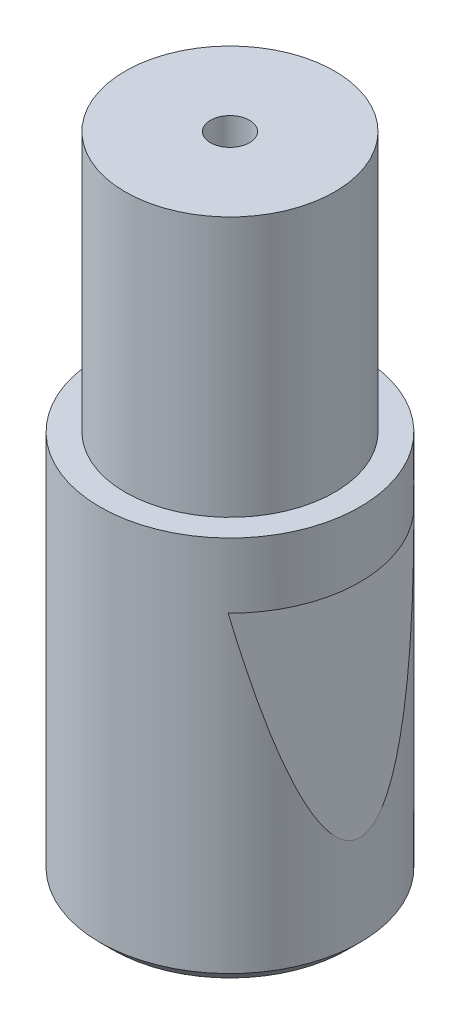
ISO-10303-21;
HEADER;
FILE_DESCRIPTION(('STEP AP214'),'2;1');
FILE_NAME('part.step','',(''),(''),'','','');
FILE_SCHEMA(('AUTOMOTIVE_DESIGN { 1 0 10303 214 1 1 1 1 }'));
ENDSEC;
DATA;
#1=APPLICATION_CONTEXT('core data for automotive mechanical design processes');
#2=APPLICATION_PROTOCOL_DEFINITION('international standard','automotive_design',2000,#1);
#3=PRODUCT_CONTEXT('',#1,'mechanical');
#4=PRODUCT('Part','Part','',(#3));
#5=PRODUCT_RELATED_PRODUCT_CATEGORY('part','',(#4));
#6=PRODUCT_DEFINITION_FORMATION('','',#4);
#7=PRODUCT_DEFINITION_CONTEXT('part definition',#1,'design');
#8=PRODUCT_DEFINITION('design','',#6,#7);
#9=PRODUCT_DEFINITION_SHAPE('','',#8);
#10=(LENGTH_UNIT() NAMED_UNIT(*) SI_UNIT(.MILLI.,.METRE.));
#11=(NAMED_UNIT(*) PLANE_ANGLE_UNIT() SI_UNIT($,.RADIAN.));
#12=(NAMED_UNIT(*) SI_UNIT($,.STERADIAN.) SOLID_ANGLE_UNIT());
#13=UNCERTAINTY_MEASURE_WITH_UNIT(LENGTH_MEASURE(1.E-05),#10,'distance_accuracy_value','');
#14=(GEOMETRIC_REPRESENTATION_CONTEXT(3) GLOBAL_UNCERTAINTY_ASSIGNED_CONTEXT((#13)) GLOBAL_UNIT_ASSIGNED_CONTEXT((#10,
#11,#12)) REPRESENTATION_CONTEXT('',''));
#15=CARTESIAN_POINT('',(0.,0.,0.));
#16=DIRECTION('',(0.,0.,1.));
#17=DIRECTION('',(1.,0.,0.));
#18=AXIS2_PLACEMENT_3D('',#15,#16,#17);
#19=CARTESIAN_POINT('',(0.,30.,0.));
#20=DIRECTION('',(0.,1.,0.));
#21=DIRECTION('',(0.,0.,1.));
#22=AXIS2_PLACEMENT_3D('',#19,#20,#21);
#23=PLANE('',#22);
#24=CARTESIAN_POINT('',(0.,30.,0.));
#25=DIRECTION('',(0.,1.,0.));
#26=DIRECTION('',(0.,0.,1.));
#27=AXIS2_PLACEMENT_3D('',#24,#25,#26);
#28=CIRCLE('',#27,10.);
#29=CARTESIAN_POINT('',(0.,30.,10.));
#30=VERTEX_POINT('',#29);
#31=EDGE_CURVE('E63',#30,#30,#28,.T.);
#32=ORIENTED_EDGE('',*,*,#31,.T.);
#33=EDGE_LOOP('',(#32));
#34=FACE_BOUND('',#33,.T.);
#35=CARTESIAN_POINT('',(0.,30.,0.));
#36=DIRECTION('',(0.,1.,0.));
#37=DIRECTION('',(0.,0.,1.));
#38=AXIS2_PLACEMENT_3D('',#35,#36,#37);
#39=CIRCLE('',#38,8.05);
#40=CARTESIAN_POINT('',(0.,30.,8.05));
#41=VERTEX_POINT('',#40);
#42=EDGE_CURVE('E53',#41,#41,#39,.T.);
#43=ORIENTED_EDGE('',*,*,#42,.F.);
#44=EDGE_LOOP('',(#43));
#45=FACE_BOUND('',#44,.T.);
#46=ADVANCED_FACE('F17',(#34,#45),#23,.T.);
#47=CARTESIAN_POINT('',(0.,30.,0.));
#48=DIRECTION('',(0.,-1.,0.));
#49=DIRECTION('',(0.,0.,-1.));
#50=AXIS2_PLACEMENT_3D('',#47,#48,#49);
#51=CYLINDRICAL_SURFACE('',#50,10.);
#52=CARTESIAN_POINT('',(0.,1.,0.));
#53=DIRECTION('',(0.,1.,0.));
#54=DIRECTION('',(0.,0.,1.));
#55=AXIS2_PLACEMENT_3D('',#52,#53,#54);
#56=CIRCLE('',#55,10.);
#57=CARTESIAN_POINT('',(0.,1.,10.));
#58=VERTEX_POINT('',#57);
#59=EDGE_CURVE('E25',#58,#58,#56,.T.);
#60=ORIENTED_EDGE('',*,*,#59,.T.);
#61=EDGE_LOOP('',(#60));
#62=FACE_BOUND('',#61,.T.);
#63=CARTESIAN_POINT('',(0.,64.6989727373255,0.));
#64=DIRECTION('',(-0.984807753012209,-0.173648177666924,0.));
#65=DIRECTION('',(0.173648177666924,-0.984807753012209,0.));
#66=AXIS2_PLACEMENT_3D('',#63,#64,#65);
#67=ELLIPSE('',#66,57.5877048314386,10.);
#68=CARTESIAN_POINT('',(7.,25.,-7.14142842854285));
#69=VERTEX_POINT('',#68);
#70=CARTESIAN_POINT('',(7.,25.,7.14142842854285));
#71=VERTEX_POINT('',#70);
#72=EDGE_CURVE('E37',#69,#71,#67,.T.);
#73=ORIENTED_EDGE('',*,*,#72,.T.);
#74=CARTESIAN_POINT('',(0.,25.,0.));
#75=DIRECTION('',(0.,1.,0.));
#76=DIRECTION('',(0.,0.,1.));
#77=AXIS2_PLACEMENT_3D('',#74,#75,#76);
#78=CIRCLE('',#77,10.);
#79=EDGE_CURVE('E68',#71,#69,#78,.T.);
#80=ORIENTED_EDGE('',*,*,#79,.T.);
#81=EDGE_LOOP('',(#73,#80));
#82=FACE_BOUND('',#81,.T.);
#83=ORIENTED_EDGE('',*,*,#31,.F.);
#84=EDGE_LOOP('',(#83));
#85=FACE_BOUND('',#84,.T.);
#86=ADVANCED_FACE('F73',(#62,#82,#85),#51,.T.);
#87=CARTESIAN_POINT('',(0.,0.,0.));
#88=DIRECTION('',(0.,1.,0.));
#89=DIRECTION('',(0.,0.,1.));
#90=AXIS2_PLACEMENT_3D('',#87,#88,#89);
#91=PLANE('',#90);
#92=CARTESIAN_POINT('',(0.,0.,0.));
#93=DIRECTION('',(0.,1.,0.));
#94=DIRECTION('',(0.,0.,1.));
#95=AXIS2_PLACEMENT_3D('',#92,#93,#94);
#96=CIRCLE('',#95,9.);
#97=CARTESIAN_POINT('',(0.,0.,9.));
#98=VERTEX_POINT('',#97);
#99=EDGE_CURVE('E11',#98,#98,#96,.F.);
#100=ORIENTED_EDGE('',*,*,#99,.T.);
#101=EDGE_LOOP('',(#100));
#102=FACE_BOUND('',#101,.T.);
#103=ADVANCED_FACE('F94',(#102),#91,.F.);
#104=CARTESIAN_POINT('',(0.,50.,0.));
#105=DIRECTION('',(0.,-1.,0.));
#106=DIRECTION('',(0.,0.,-1.));
#107=AXIS2_PLACEMENT_3D('',#104,#105,#106);
#108=CYLINDRICAL_SURFACE('',#107,8.05);
#109=CARTESIAN_POINT('',(0.,50.,0.));
#110=DIRECTION('',(0.,1.,0.));
#111=DIRECTION('',(0.,0.,1.));
#112=AXIS2_PLACEMENT_3D('',#109,#110,#111);
#113=CIRCLE('',#112,8.05);
#114=CARTESIAN_POINT('',(0.,50.,8.05));
#115=VERTEX_POINT('',#114);
#116=EDGE_CURVE('E60',#115,#115,#113,.T.);
#117=ORIENTED_EDGE('',*,*,#116,.F.);
#118=EDGE_LOOP('',(#117));
#119=FACE_BOUND('',#118,.T.);
#120=ORIENTED_EDGE('',*,*,#42,.T.);
#121=EDGE_LOOP('',(#120));
#122=FACE_BOUND('',#121,.T.);
#123=ADVANCED_FACE('F98',(#119,#122),#108,.T.);
#124=CARTESIAN_POINT('',(0.,50.,0.));
#125=DIRECTION('',(0.,1.,0.));
#126=DIRECTION('',(0.,0.,1.));
#127=AXIS2_PLACEMENT_3D('',#124,#125,#126);
#128=PLANE('',#127);
#129=CARTESIAN_POINT('',(0.,50.,0.));
#130=DIRECTION('',(0.,1.,0.));
#131=DIRECTION('',(0.,0.,1.));
#132=AXIS2_PLACEMENT_3D('',#129,#130,#131);
#133=CIRCLE('',#132,1.5);
#134=CARTESIAN_POINT('',(0.,50.,1.5));
#135=VERTEX_POINT('',#134);
#136=EDGE_CURVE('E139',#135,#135,#133,.T.);
#137=ORIENTED_EDGE('',*,*,#136,.F.);
#138=EDGE_LOOP('',(#137));
#139=FACE_BOUND('',#138,.T.);
#140=ORIENTED_EDGE('',*,*,#116,.T.);
#141=EDGE_LOOP('',(#140));
#142=FACE_BOUND('',#141,.T.);
#143=ADVANCED_FACE('F106',(#139,#142),#128,.T.);
#144=CARTESIAN_POINT('',(7.,25.,-10.));
#145=DIRECTION('',(-0.984807753012209,-0.173648177666924,0.));
#146=DIRECTION('',(0.173648177666924,-0.984807753012209,0.));
#147=AXIS2_PLACEMENT_3D('',#144,#145,#146);
#148=PLANE('',#147);
#149=ORIENTED_EDGE('',*,*,#72,.F.);
#150=DIRECTION('',(0.,0.,1.));
#151=VECTOR('',#150,1.);
#152=CARTESIAN_POINT('',(7.,25.,-10.));
#153=LINE('',#152,#151);
#154=EDGE_CURVE('E31',#69,#71,#153,.T.);
#155=ORIENTED_EDGE('',*,*,#154,.T.);
#156=EDGE_LOOP('',(#149,#155));
#157=FACE_BOUND('',#156,.T.);
#158=ADVANCED_FACE('F112',(#157),#148,.F.);
#159=CARTESIAN_POINT('',(10.,25.,-10.));
#160=DIRECTION('',(0.,1.,0.));
#161=DIRECTION('',(0.,0.,1.));
#162=AXIS2_PLACEMENT_3D('',#159,#160,#161);
#163=PLANE('',#162);
#164=ORIENTED_EDGE('',*,*,#154,.F.);
#165=ORIENTED_EDGE('',*,*,#79,.F.);
#166=EDGE_LOOP('',(#164,#165));
#167=FACE_BOUND('',#166,.T.);
#168=ADVANCED_FACE('F45',(#167),#163,.F.);
#169=CARTESIAN_POINT('',(0.,39.5,0.));
#170=DIRECTION('',(0.,1.,0.));
#171=DIRECTION('',(0.,0.,1.));
#172=AXIS2_PLACEMENT_3D('',#169,#170,#171);
#173=CONICAL_SURFACE('',#172,1.25,1.02974425867665);
#174=CARTESIAN_POINT('',(0.,38.7489242262155,0.));
#175=VERTEX_POINT('',#174);
#176=VERTEX_LOOP('',#175);
#177=FACE_BOUND('',#176,.T.);
#178=CARTESIAN_POINT('',(0.,39.5,0.));
#179=DIRECTION('',(0.,1.,0.));
#180=DIRECTION('',(0.,0.,1.));
#181=AXIS2_PLACEMENT_3D('',#178,#179,#180);
#182=CIRCLE('',#181,1.25);
#183=CARTESIAN_POINT('',(0.,39.5,1.25));
#184=VERTEX_POINT('',#183);
#185=EDGE_CURVE('E49',#184,#184,#182,.T.);
#186=ORIENTED_EDGE('',*,*,#185,.T.);
#187=EDGE_LOOP('',(#186));
#188=FACE_BOUND('',#187,.T.);
#189=ADVANCED_FACE('F41',(#177,#188),#173,.F.);
#190=CARTESIAN_POINT('',(0.,50.,0.));
#191=DIRECTION('',(0.,1.,0.));
#192=DIRECTION('',(0.,0.,1.));
#193=AXIS2_PLACEMENT_3D('',#190,#191,#192);
#194=CYLINDRICAL_SURFACE('',#193,1.25);
#195=ORIENTED_EDGE('',*,*,#185,.F.);
#196=EDGE_LOOP('',(#195));
#197=FACE_BOUND('',#196,.T.);
#198=CARTESIAN_POINT('',(0.,41.,0.));
#199=DIRECTION('',(0.,1.,0.));
#200=DIRECTION('',(0.,0.,1.));
#201=AXIS2_PLACEMENT_3D('',#198,#199,#200);
#202=CIRCLE('',#201,1.25);
#203=CARTESIAN_POINT('',(0.,41.,1.25));
#204=VERTEX_POINT('',#203);
#205=EDGE_CURVE('E51',#204,#204,#202,.T.);
#206=ORIENTED_EDGE('',*,*,#205,.T.);
#207=EDGE_LOOP('',(#206));
#208=FACE_BOUND('',#207,.T.);
#209=ADVANCED_FACE('F44',(#197,#208),#194,.F.);
#210=CARTESIAN_POINT('',(1.25,41.,0.));
#211=DIRECTION('',(0.,-1.,0.));
#212=DIRECTION('',(0.,0.,-1.));
#213=AXIS2_PLACEMENT_3D('',#210,#211,#212);
#214=PLANE('',#213);
#215=ORIENTED_EDGE('',*,*,#205,.F.);
#216=EDGE_LOOP('',(#215));
#217=FACE_BOUND('',#216,.T.);
#218=CARTESIAN_POINT('',(0.,41.,0.));
#219=DIRECTION('',(0.,1.,0.));
#220=DIRECTION('',(0.,0.,1.));
#221=AXIS2_PLACEMENT_3D('',#218,#219,#220);
#222=CIRCLE('',#221,1.5);
#223=CARTESIAN_POINT('',(0.,41.,1.5));
#224=VERTEX_POINT('',#223);
#225=EDGE_CURVE('E56',#224,#224,#222,.T.);
#226=ORIENTED_EDGE('',*,*,#225,.T.);
#227=EDGE_LOOP('',(#226));
#228=FACE_BOUND('',#227,.T.);
#229=ADVANCED_FACE('F83',(#217,#228),#214,.F.);
#230=CARTESIAN_POINT('',(0.,50.,0.));
#231=DIRECTION('',(0.,1.,0.));
#232=DIRECTION('',(0.,0.,1.));
#233=AXIS2_PLACEMENT_3D('',#230,#231,#232);
#234=CYLINDRICAL_SURFACE('',#233,1.5);
#235=ORIENTED_EDGE('',*,*,#225,.F.);
#236=EDGE_LOOP('',(#235));
#237=FACE_BOUND('',#236,.T.);
#238=ORIENTED_EDGE('',*,*,#136,.T.);
#239=EDGE_LOOP('',(#238));
#240=FACE_BOUND('',#239,.T.);
#241=ADVANCED_FACE('F76',(#237,#240),#234,.F.);
#242=CARTESIAN_POINT('',(0.,1.,0.));
#243=DIRECTION('',(0.,1.,0.));
#244=DIRECTION('',(0.,0.,1.));
#245=AXIS2_PLACEMENT_3D('',#242,#243,#244);
#246=CONICAL_SURFACE('',#245,10.,0.785398163397452);
#247=ORIENTED_EDGE('',*,*,#99,.F.);
#248=EDGE_LOOP('',(#247));
#249=FACE_BOUND('',#248,.T.);
#250=ORIENTED_EDGE('',*,*,#59,.F.);
#251=EDGE_LOOP('',(#250));
#252=FACE_BOUND('',#251,.T.);
#253=ADVANCED_FACE('F19',(#249,#252),#246,.T.);
#254=CLOSED_SHELL('',(#46,#86,#103,#123,#143,#158,#168,#189,#209,#229,#241,#253));
#255=MANIFOLD_SOLID_BREP('B1',#254);
#256=ADVANCED_BREP_SHAPE_REPRESENTATION('',(#18,#255),#14);
#257=SHAPE_DEFINITION_REPRESENTATION(#9,#256);
ENDSEC;
END-ISO-10303-21;
